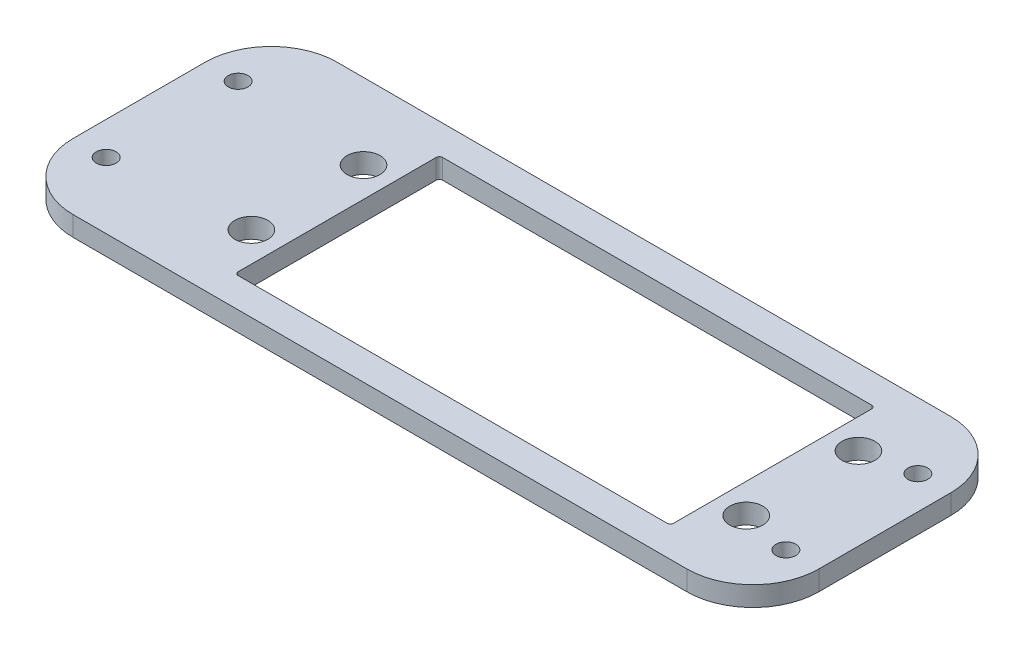
ISO-10303-21;
HEADER;
FILE_DESCRIPTION(('STEP AP214'),'2;1');
FILE_NAME('part.step','',(''),(''),'','','');
FILE_SCHEMA(('AUTOMOTIVE_DESIGN { 1 0 10303 214 1 1 1 1 }'));
ENDSEC;
DATA;
#1=APPLICATION_CONTEXT('core data for automotive mechanical design processes');
#2=APPLICATION_PROTOCOL_DEFINITION('international standard','automotive_design',2000,#1);
#3=PRODUCT_CONTEXT('',#1,'mechanical');
#4=PRODUCT('Part','Part','',(#3));
#5=PRODUCT_RELATED_PRODUCT_CATEGORY('part','',(#4));
#6=PRODUCT_DEFINITION_FORMATION('','',#4);
#7=PRODUCT_DEFINITION_CONTEXT('part definition',#1,'design');
#8=PRODUCT_DEFINITION('design','',#6,#7);
#9=PRODUCT_DEFINITION_SHAPE('','',#8);
#10=(LENGTH_UNIT() NAMED_UNIT(*) SI_UNIT(.MILLI.,.METRE.));
#11=(NAMED_UNIT(*) PLANE_ANGLE_UNIT() SI_UNIT($,.RADIAN.));
#12=(NAMED_UNIT(*) SI_UNIT($,.STERADIAN.) SOLID_ANGLE_UNIT());
#13=UNCERTAINTY_MEASURE_WITH_UNIT(LENGTH_MEASURE(1.E-05),#10,'distance_accuracy_value','');
#14=(GEOMETRIC_REPRESENTATION_CONTEXT(3) GLOBAL_UNCERTAINTY_ASSIGNED_CONTEXT((#13)) GLOBAL_UNIT_ASSIGNED_CONTEXT((#10,
#11,#12)) REPRESENTATION_CONTEXT('',''));
#15=CARTESIAN_POINT('',(0.,0.,0.));
#16=DIRECTION('',(0.,0.,1.));
#17=DIRECTION('',(1.,0.,0.));
#18=AXIS2_PLACEMENT_3D('',#15,#16,#17);
#19=CARTESIAN_POINT('',(33.,3.,0.));
#20=DIRECTION('',(-1.,0.,0.));
#21=DIRECTION('',(0.,0.,1.));
#22=AXIS2_PLACEMENT_3D('',#19,#20,#21);
#23=PLANE('',#22);
#24=DIRECTION('',(0.,0.,-1.));
#25=VECTOR('',#24,1.);
#26=CARTESIAN_POINT('',(33.,0.,0.));
#27=LINE('',#26,#25);
#28=CARTESIAN_POINT('',(33.,0.,15.));
#29=VERTEX_POINT('',#28);
#30=CARTESIAN_POINT('',(33.,0.,-15.));
#31=VERTEX_POINT('',#30);
#32=EDGE_CURVE('E183',#29,#31,#27,.T.);
#33=ORIENTED_EDGE('',*,*,#32,.F.);
#34=DIRECTION('',(0.,-1.,0.));
#35=VECTOR('',#34,1.);
#36=CARTESIAN_POINT('',(33.,3.,15.));
#37=LINE('',#36,#35);
#38=CARTESIAN_POINT('',(33.,3.,15.));
#39=VERTEX_POINT('',#38);
#40=EDGE_CURVE('E204',#29,#39,#37,.F.);
#41=ORIENTED_EDGE('',*,*,#40,.T.);
#42=DIRECTION('',(0.,0.,-1.));
#43=VECTOR('',#42,1.);
#44=CARTESIAN_POINT('',(33.,3.,0.));
#45=LINE('',#44,#43);
#46=CARTESIAN_POINT('',(33.,3.,-15.));
#47=VERTEX_POINT('',#46);
#48=EDGE_CURVE('E360',#39,#47,#45,.T.);
#49=ORIENTED_EDGE('',*,*,#48,.T.);
#50=DIRECTION('',(0.,-1.,0.));
#51=VECTOR('',#50,1.);
#52=CARTESIAN_POINT('',(33.,3.,-15.));
#53=LINE('',#52,#51);
#54=EDGE_CURVE('E192',#47,#31,#53,.T.);
#55=ORIENTED_EDGE('',*,*,#54,.T.);
#56=EDGE_LOOP('',(#33,#41,#49,#55));
#57=FACE_BOUND('',#56,.T.);
#58=ADVANCED_FACE('F45',(#57),#23,.T.);
#59=CARTESIAN_POINT('',(0.,3.,15.5));
#60=DIRECTION('',(0.,0.,-1.));
#61=DIRECTION('',(-1.,0.,0.));
#62=AXIS2_PLACEMENT_3D('',#59,#60,#61);
#63=PLANE('',#62);
#64=DIRECTION('',(1.,0.,0.));
#65=VECTOR('',#64,1.);
#66=CARTESIAN_POINT('',(0.,3.,15.5));
#67=LINE('',#66,#65);
#68=CARTESIAN_POINT('',(-32.5,3.,15.5));
#69=VERTEX_POINT('',#68);
#70=CARTESIAN_POINT('',(32.5,3.,15.5));
#71=VERTEX_POINT('',#70);
#72=EDGE_CURVE('E364',#69,#71,#67,.T.);
#73=ORIENTED_EDGE('',*,*,#72,.T.);
#74=DIRECTION('',(0.,-1.,0.));
#75=VECTOR('',#74,1.);
#76=CARTESIAN_POINT('',(32.5,0.,15.5));
#77=LINE('',#76,#75);
#78=CARTESIAN_POINT('',(32.5,0.,15.5));
#79=VERTEX_POINT('',#78);
#80=EDGE_CURVE('E181',#71,#79,#77,.T.);
#81=ORIENTED_EDGE('',*,*,#80,.T.);
#82=DIRECTION('',(1.,0.,0.));
#83=VECTOR('',#82,1.);
#84=CARTESIAN_POINT('',(0.,0.,15.5));
#85=LINE('',#84,#83);
#86=CARTESIAN_POINT('',(-32.5,0.,15.5));
#87=VERTEX_POINT('',#86);
#88=EDGE_CURVE('E163',#87,#79,#85,.T.);
#89=ORIENTED_EDGE('',*,*,#88,.F.);
#90=DIRECTION('',(0.,-1.,0.));
#91=VECTOR('',#90,1.);
#92=CARTESIAN_POINT('',(-32.5,3.,15.5));
#93=LINE('',#92,#91);
#94=EDGE_CURVE('E178',#87,#69,#93,.F.);
#95=ORIENTED_EDGE('',*,*,#94,.T.);
#96=EDGE_LOOP('',(#73,#81,#89,#95));
#97=FACE_BOUND('',#96,.T.);
#98=ADVANCED_FACE('F177',(#97),#63,.T.);
#99=CARTESIAN_POINT('',(-33.,3.,0.));
#100=DIRECTION('',(-1.,0.,0.));
#101=DIRECTION('',(0.,0.,1.));
#102=AXIS2_PLACEMENT_3D('',#99,#100,#101);
#103=PLANE('',#102);
#104=DIRECTION('',(0.,0.,-1.));
#105=VECTOR('',#104,1.);
#106=CARTESIAN_POINT('',(-33.,3.,0.));
#107=LINE('',#106,#105);
#108=CARTESIAN_POINT('',(-33.,3.,15.));
#109=VERTEX_POINT('',#108);
#110=CARTESIAN_POINT('',(-33.,3.,-15.));
#111=VERTEX_POINT('',#110);
#112=EDGE_CURVE('E367',#109,#111,#107,.T.);
#113=ORIENTED_EDGE('',*,*,#112,.F.);
#114=DIRECTION('',(0.,-1.,0.));
#115=VECTOR('',#114,1.);
#116=CARTESIAN_POINT('',(-33.,3.,15.));
#117=LINE('',#116,#115);
#118=CARTESIAN_POINT('',(-33.,0.,15.));
#119=VERTEX_POINT('',#118);
#120=EDGE_CURVE('E210',#109,#119,#117,.T.);
#121=ORIENTED_EDGE('',*,*,#120,.T.);
#122=DIRECTION('',(0.,0.,-1.));
#123=VECTOR('',#122,1.);
#124=CARTESIAN_POINT('',(-33.,0.,0.));
#125=LINE('',#124,#123);
#126=CARTESIAN_POINT('',(-33.,0.,-15.));
#127=VERTEX_POINT('',#126);
#128=EDGE_CURVE('E165',#119,#127,#125,.T.);
#129=ORIENTED_EDGE('',*,*,#128,.T.);
#130=DIRECTION('',(0.,-1.,0.));
#131=VECTOR('',#130,1.);
#132=CARTESIAN_POINT('',(-33.,3.,-15.));
#133=LINE('',#132,#131);
#134=EDGE_CURVE('E207',#127,#111,#133,.F.);
#135=ORIENTED_EDGE('',*,*,#134,.T.);
#136=EDGE_LOOP('',(#113,#121,#129,#135));
#137=FACE_BOUND('',#136,.T.);
#138=ADVANCED_FACE('F435',(#137),#103,.F.);
#139=CARTESIAN_POINT('',(0.,3.,20.));
#140=DIRECTION('',(0.,0.,-1.));
#141=DIRECTION('',(-1.,0.,0.));
#142=AXIS2_PLACEMENT_3D('',#139,#140,#141);
#143=PLANE('',#142);
#144=DIRECTION('',(1.,0.,0.));
#145=VECTOR('',#144,1.);
#146=CARTESIAN_POINT('',(0.,0.,20.));
#147=LINE('',#146,#145);
#148=CARTESIAN_POINT('',(-53.,0.,20.));
#149=VERTEX_POINT('',#148);
#150=CARTESIAN_POINT('',(40.,0.,20.));
#151=VERTEX_POINT('',#150);
#152=EDGE_CURVE('E402',#149,#151,#147,.T.);
#153=ORIENTED_EDGE('',*,*,#152,.T.);
#154=DIRECTION('',(0.,-1.,0.));
#155=VECTOR('',#154,1.);
#156=CARTESIAN_POINT('',(40.,3.,20.));
#157=LINE('',#156,#155);
#158=CARTESIAN_POINT('',(40.,3.,20.));
#159=VERTEX_POINT('',#158);
#160=EDGE_CURVE('E280',#151,#159,#157,.F.);
#161=ORIENTED_EDGE('',*,*,#160,.T.);
#162=DIRECTION('',(1.,0.,0.));
#163=VECTOR('',#162,1.);
#164=CARTESIAN_POINT('',(0.,3.,20.));
#165=LINE('',#164,#163);
#166=CARTESIAN_POINT('',(-53.,3.,20.));
#167=VERTEX_POINT('',#166);
#168=EDGE_CURVE('E344',#167,#159,#165,.T.);
#169=ORIENTED_EDGE('',*,*,#168,.F.);
#170=DIRECTION('',(0.,-1.,0.));
#171=VECTOR('',#170,1.);
#172=CARTESIAN_POINT('',(-53.,3.,20.));
#173=LINE('',#172,#171);
#174=EDGE_CURVE('E276',#167,#149,#173,.T.);
#175=ORIENTED_EDGE('',*,*,#174,.T.);
#176=EDGE_LOOP('',(#153,#161,#169,#175));
#177=FACE_BOUND('',#176,.T.);
#178=ADVANCED_FACE('F449',(#177),#143,.F.);
#179=CARTESIAN_POINT('',(50.,3.,0.));
#180=DIRECTION('',(-1.,0.,0.));
#181=DIRECTION('',(0.,0.,1.));
#182=AXIS2_PLACEMENT_3D('',#179,#180,#181);
#183=PLANE('',#182);
#184=DIRECTION('',(0.,0.,-1.));
#185=VECTOR('',#184,1.);
#186=CARTESIAN_POINT('',(50.,0.,0.));
#187=LINE('',#186,#185);
#188=CARTESIAN_POINT('',(50.,0.,10.));
#189=VERTEX_POINT('',#188);
#190=CARTESIAN_POINT('',(50.,0.,-10.));
#191=VERTEX_POINT('',#190);
#192=EDGE_CURVE('E301',#189,#191,#187,.T.);
#193=ORIENTED_EDGE('',*,*,#192,.T.);
#194=DIRECTION('',(0.,-1.,0.));
#195=VECTOR('',#194,1.);
#196=CARTESIAN_POINT('',(50.,3.,-10.));
#197=LINE('',#196,#195);
#198=CARTESIAN_POINT('',(50.,3.,-10.));
#199=VERTEX_POINT('',#198);
#200=EDGE_CURVE('E262',#191,#199,#197,.F.);
#201=ORIENTED_EDGE('',*,*,#200,.T.);
#202=DIRECTION('',(0.,0.,-1.));
#203=VECTOR('',#202,1.);
#204=CARTESIAN_POINT('',(50.,3.,0.));
#205=LINE('',#204,#203);
#206=CARTESIAN_POINT('',(50.,3.,10.));
#207=VERTEX_POINT('',#206);
#208=EDGE_CURVE('E350',#207,#199,#205,.T.);
#209=ORIENTED_EDGE('',*,*,#208,.F.);
#210=DIRECTION('',(0.,-1.,0.));
#211=VECTOR('',#210,1.);
#212=CARTESIAN_POINT('',(50.,3.,10.));
#213=LINE('',#212,#211);
#214=EDGE_CURVE('E258',#207,#189,#213,.T.);
#215=ORIENTED_EDGE('',*,*,#214,.T.);
#216=EDGE_LOOP('',(#193,#201,#209,#215));
#217=FACE_BOUND('',#216,.T.);
#218=ADVANCED_FACE('F410',(#217),#183,.F.);
#219=CARTESIAN_POINT('',(0.,3.,-20.));
#220=DIRECTION('',(0.,0.,-1.));
#221=DIRECTION('',(-1.,0.,0.));
#222=AXIS2_PLACEMENT_3D('',#219,#220,#221);
#223=PLANE('',#222);
#224=DIRECTION('',(1.,0.,0.));
#225=VECTOR('',#224,1.);
#226=CARTESIAN_POINT('',(0.,3.,-20.));
#227=LINE('',#226,#225);
#228=CARTESIAN_POINT('',(-53.,3.,-20.));
#229=VERTEX_POINT('',#228);
#230=CARTESIAN_POINT('',(40.,3.,-20.));
#231=VERTEX_POINT('',#230);
#232=EDGE_CURVE('E354',#229,#231,#227,.T.);
#233=ORIENTED_EDGE('',*,*,#232,.T.);
#234=DIRECTION('',(0.,-1.,0.));
#235=VECTOR('',#234,1.);
#236=CARTESIAN_POINT('',(40.,0.,-20.));
#237=LINE('',#236,#235);
#238=CARTESIAN_POINT('',(40.,0.,-20.));
#239=VERTEX_POINT('',#238);
#240=EDGE_CURVE('E242',#231,#239,#237,.T.);
#241=ORIENTED_EDGE('',*,*,#240,.T.);
#242=DIRECTION('',(1.,0.,0.));
#243=VECTOR('',#242,1.);
#244=CARTESIAN_POINT('',(0.,0.,-20.));
#245=LINE('',#244,#243);
#246=CARTESIAN_POINT('',(-53.,0.,-20.));
#247=VERTEX_POINT('',#246);
#248=EDGE_CURVE('E295',#247,#239,#245,.T.);
#249=ORIENTED_EDGE('',*,*,#248,.F.);
#250=DIRECTION('',(0.,-1.,0.));
#251=VECTOR('',#250,1.);
#252=CARTESIAN_POINT('',(-53.,3.,-20.));
#253=LINE('',#252,#251);
#254=EDGE_CURVE('E239',#247,#229,#253,.F.);
#255=ORIENTED_EDGE('',*,*,#254,.T.);
#256=EDGE_LOOP('',(#233,#241,#249,#255));
#257=FACE_BOUND('',#256,.T.);
#258=ADVANCED_FACE('F420',(#257),#223,.T.);
#259=CARTESIAN_POINT('',(-58.,3.,-10.));
#260=DIRECTION('',(0.,-1.,0.));
#261=DIRECTION('',(0.,0.,-1.));
#262=AXIS2_PLACEMENT_3D('',#259,#260,#261);
#263=CYLINDRICAL_SURFACE('',#262,1.5);
#264=CARTESIAN_POINT('',(-58.,3.,-10.));
#265=DIRECTION('',(0.,1.,0.));
#266=DIRECTION('',(0.,0.,1.));
#267=AXIS2_PLACEMENT_3D('',#264,#265,#266);
#268=CIRCLE('',#267,1.5);
#269=CARTESIAN_POINT('',(-58.,3.,-8.49999999999999));
#270=VERTEX_POINT('',#269);
#271=EDGE_CURVE('E195',#270,#270,#268,.T.);
#272=ORIENTED_EDGE('',*,*,#271,.T.);
#273=EDGE_LOOP('',(#272));
#274=FACE_BOUND('',#273,.T.);
#275=CARTESIAN_POINT('',(-58.,0.,-10.));
#276=DIRECTION('',(0.,1.,0.));
#277=DIRECTION('',(0.,0.,1.));
#278=AXIS2_PLACEMENT_3D('',#275,#276,#277);
#279=CIRCLE('',#278,1.5);
#280=CARTESIAN_POINT('',(-58.,0.,-8.49999999999999));
#281=VERTEX_POINT('',#280);
#282=EDGE_CURVE('E326',#281,#281,#279,.T.);
#283=ORIENTED_EDGE('',*,*,#282,.F.);
#284=EDGE_LOOP('',(#283));
#285=FACE_BOUND('',#284,.T.);
#286=ADVANCED_FACE('F446',(#274,#285),#263,.F.);
#287=CARTESIAN_POINT('',(45.,3.,10.));
#288=DIRECTION('',(0.,-1.,0.));
#289=DIRECTION('',(0.,0.,-1.));
#290=AXIS2_PLACEMENT_3D('',#287,#288,#289);
#291=CYLINDRICAL_SURFACE('',#290,1.5);
#292=CARTESIAN_POINT('',(45.,3.,10.));
#293=DIRECTION('',(0.,1.,0.));
#294=DIRECTION('',(0.,0.,1.));
#295=AXIS2_PLACEMENT_3D('',#292,#293,#294);
#296=CIRCLE('',#295,1.5);
#297=CARTESIAN_POINT('',(45.,3.,11.5));
#298=VERTEX_POINT('',#297);
#299=EDGE_CURVE('E387',#298,#298,#296,.F.);
#300=ORIENTED_EDGE('',*,*,#299,.F.);
#301=EDGE_LOOP('',(#300));
#302=FACE_BOUND('',#301,.T.);
#303=CARTESIAN_POINT('',(45.,0.,10.));
#304=DIRECTION('',(0.,1.,0.));
#305=DIRECTION('',(0.,0.,1.));
#306=AXIS2_PLACEMENT_3D('',#303,#304,#305);
#307=CIRCLE('',#306,1.5);
#308=CARTESIAN_POINT('',(45.,0.,11.5));
#309=VERTEX_POINT('',#308);
#310=EDGE_CURVE('E323',#309,#309,#307,.F.);
#311=ORIENTED_EDGE('',*,*,#310,.T.);
#312=EDGE_LOOP('',(#311));
#313=FACE_BOUND('',#312,.T.);
#314=ADVANCED_FACE('F616',(#302,#313),#291,.F.);
#315=CARTESIAN_POINT('',(45.,3.,-10.));
#316=DIRECTION('',(0.,-1.,0.));
#317=DIRECTION('',(0.,0.,-1.));
#318=AXIS2_PLACEMENT_3D('',#315,#316,#317);
#319=CYLINDRICAL_SURFACE('',#318,1.5);
#320=CARTESIAN_POINT('',(45.,3.,-10.));
#321=DIRECTION('',(0.,1.,0.));
#322=DIRECTION('',(0.,0.,1.));
#323=AXIS2_PLACEMENT_3D('',#320,#321,#322);
#324=CIRCLE('',#323,1.5);
#325=CARTESIAN_POINT('',(45.,3.,-8.49999999999999));
#326=VERTEX_POINT('',#325);
#327=EDGE_CURVE('E383',#326,#326,#324,.T.);
#328=ORIENTED_EDGE('',*,*,#327,.T.);
#329=EDGE_LOOP('',(#328));
#330=FACE_BOUND('',#329,.T.);
#331=CARTESIAN_POINT('',(45.,0.,-10.));
#332=DIRECTION('',(0.,1.,0.));
#333=DIRECTION('',(0.,0.,1.));
#334=AXIS2_PLACEMENT_3D('',#331,#332,#333);
#335=CIRCLE('',#334,1.5);
#336=CARTESIAN_POINT('',(45.,0.,-8.49999999999999));
#337=VERTEX_POINT('',#336);
#338=EDGE_CURVE('E319',#337,#337,#335,.T.);
#339=ORIENTED_EDGE('',*,*,#338,.F.);
#340=EDGE_LOOP('',(#339));
#341=FACE_BOUND('',#340,.T.);
#342=ADVANCED_FACE('F606',(#330,#341),#319,.F.);
#343=CARTESIAN_POINT('',(37.5,3.,8.49999999999999));
#344=DIRECTION('',(0.,-1.,0.));
#345=DIRECTION('',(0.,0.,-1.));
#346=AXIS2_PLACEMENT_3D('',#343,#344,#345);
#347=CYLINDRICAL_SURFACE('',#346,2.5);
#348=CARTESIAN_POINT('',(37.5,3.,8.49999999999999));
#349=DIRECTION('',(0.,1.,0.));
#350=DIRECTION('',(0.,0.,1.));
#351=AXIS2_PLACEMENT_3D('',#348,#349,#350);
#352=CIRCLE('',#351,2.5);
#353=CARTESIAN_POINT('',(37.5,3.,11.));
#354=VERTEX_POINT('',#353);
#355=EDGE_CURVE('E379',#354,#354,#352,.F.);
#356=ORIENTED_EDGE('',*,*,#355,.F.);
#357=EDGE_LOOP('',(#356));
#358=FACE_BOUND('',#357,.T.);
#359=CARTESIAN_POINT('',(37.5,0.,8.49999999999999));
#360=DIRECTION('',(0.,1.,0.));
#361=DIRECTION('',(0.,0.,1.));
#362=AXIS2_PLACEMENT_3D('',#359,#360,#361);
#363=CIRCLE('',#362,2.5);
#364=CARTESIAN_POINT('',(37.5,0.,11.));
#365=VERTEX_POINT('',#364);
#366=EDGE_CURVE('E315',#365,#365,#363,.F.);
#367=ORIENTED_EDGE('',*,*,#366,.T.);
#368=EDGE_LOOP('',(#367));
#369=FACE_BOUND('',#368,.T.);
#370=ADVANCED_FACE('F596',(#358,#369),#347,.F.);
#371=CARTESIAN_POINT('',(37.5,3.,-8.50000000000001));
#372=DIRECTION('',(0.,-1.,0.));
#373=DIRECTION('',(0.,0.,-1.));
#374=AXIS2_PLACEMENT_3D('',#371,#372,#373);
#375=CYLINDRICAL_SURFACE('',#374,2.5);
#376=CARTESIAN_POINT('',(37.5,3.,-8.50000000000001));
#377=DIRECTION('',(0.,1.,0.));
#378=DIRECTION('',(0.,0.,1.));
#379=AXIS2_PLACEMENT_3D('',#376,#377,#378);
#380=CIRCLE('',#379,2.5);
#381=CARTESIAN_POINT('',(37.5,3.,-6.00000000000001));
#382=VERTEX_POINT('',#381);
#383=EDGE_CURVE('E375',#382,#382,#380,.T.);
#384=ORIENTED_EDGE('',*,*,#383,.T.);
#385=EDGE_LOOP('',(#384));
#386=FACE_BOUND('',#385,.T.);
#387=CARTESIAN_POINT('',(37.5,0.,-8.50000000000001));
#388=DIRECTION('',(0.,1.,0.));
#389=DIRECTION('',(0.,0.,1.));
#390=AXIS2_PLACEMENT_3D('',#387,#388,#389);
#391=CIRCLE('',#390,2.5);
#392=CARTESIAN_POINT('',(37.5,0.,-6.00000000000001));
#393=VERTEX_POINT('',#392);
#394=EDGE_CURVE('E311',#393,#393,#391,.T.);
#395=ORIENTED_EDGE('',*,*,#394,.F.);
#396=EDGE_LOOP('',(#395));
#397=FACE_BOUND('',#396,.T.);
#398=ADVANCED_FACE('F586',(#386,#397),#375,.F.);
#399=CARTESIAN_POINT('',(0.,3.,-15.5));
#400=DIRECTION('',(0.,0.,-1.));
#401=DIRECTION('',(-1.,0.,0.));
#402=AXIS2_PLACEMENT_3D('',#399,#400,#401);
#403=PLANE('',#402);
#404=DIRECTION('',(1.,0.,0.));
#405=VECTOR('',#404,1.);
#406=CARTESIAN_POINT('',(0.,0.,-15.5));
#407=LINE('',#406,#405);
#408=CARTESIAN_POINT('',(-32.5,0.,-15.5));
#409=VERTEX_POINT('',#408);
#410=CARTESIAN_POINT('',(32.5,0.,-15.5));
#411=VERTEX_POINT('',#410);
#412=EDGE_CURVE('E307',#409,#411,#407,.T.);
#413=ORIENTED_EDGE('',*,*,#412,.T.);
#414=DIRECTION('',(0.,-1.,0.));
#415=VECTOR('',#414,1.);
#416=CARTESIAN_POINT('',(32.5,3.,-15.5));
#417=LINE('',#416,#415);
#418=CARTESIAN_POINT('',(32.5,3.,-15.5));
#419=VERTEX_POINT('',#418);
#420=EDGE_CURVE('E217',#411,#419,#417,.F.);
#421=ORIENTED_EDGE('',*,*,#420,.T.);
#422=DIRECTION('',(1.,0.,0.));
#423=VECTOR('',#422,1.);
#424=CARTESIAN_POINT('',(0.,3.,-15.5));
#425=LINE('',#424,#423);
#426=CARTESIAN_POINT('',(-32.5,3.,-15.5));
#427=VERTEX_POINT('',#426);
#428=EDGE_CURVE('E371',#427,#419,#425,.T.);
#429=ORIENTED_EDGE('',*,*,#428,.F.);
#430=DIRECTION('',(0.,-1.,0.));
#431=VECTOR('',#430,1.);
#432=CARTESIAN_POINT('',(-32.5,0.,-15.5));
#433=LINE('',#432,#431);
#434=EDGE_CURVE('E213',#427,#409,#433,.T.);
#435=ORIENTED_EDGE('',*,*,#434,.T.);
#436=EDGE_LOOP('',(#413,#421,#429,#435));
#437=FACE_BOUND('',#436,.T.);
#438=ADVANCED_FACE('F443',(#437),#403,.F.);
#439=CARTESIAN_POINT('',(-63.,3.,0.));
#440=DIRECTION('',(1.,0.,0.));
#441=DIRECTION('',(0.,0.,-1.));
#442=AXIS2_PLACEMENT_3D('',#439,#440,#441);
#443=PLANE('',#442);
#444=DIRECTION('',(0.,0.,1.));
#445=VECTOR('',#444,1.);
#446=CARTESIAN_POINT('',(-63.,0.,0.));
#447=LINE('',#446,#445);
#448=CARTESIAN_POINT('',(-63.,0.,-10.));
#449=VERTEX_POINT('',#448);
#450=CARTESIAN_POINT('',(-63.,0.,10.));
#451=VERTEX_POINT('',#450);
#452=EDGE_CURVE('E287',#449,#451,#447,.T.);
#453=ORIENTED_EDGE('',*,*,#452,.T.);
#454=DIRECTION('',(0.,-1.,0.));
#455=VECTOR('',#454,1.);
#456=CARTESIAN_POINT('',(-63.,3.,10.));
#457=LINE('',#456,#455);
#458=CARTESIAN_POINT('',(-63.,3.,10.));
#459=VERTEX_POINT('',#458);
#460=EDGE_CURVE('E11',#451,#459,#457,.F.);
#461=ORIENTED_EDGE('',*,*,#460,.T.);
#462=DIRECTION('',(0.,0.,1.));
#463=VECTOR('',#462,1.);
#464=CARTESIAN_POINT('',(-63.,3.,0.));
#465=LINE('',#464,#463);
#466=CARTESIAN_POINT('',(-63.,3.,-10.));
#467=VERTEX_POINT('',#466);
#468=EDGE_CURVE('E288',#467,#459,#465,.T.);
#469=ORIENTED_EDGE('',*,*,#468,.F.);
#470=DIRECTION('',(0.,-1.,0.));
#471=VECTOR('',#470,1.);
#472=CARTESIAN_POINT('',(-63.,0.,-10.));
#473=LINE('',#472,#471);
#474=EDGE_CURVE('E54',#467,#449,#473,.T.);
#475=ORIENTED_EDGE('',*,*,#474,.T.);
#476=EDGE_LOOP('',(#453,#461,#469,#475));
#477=FACE_BOUND('',#476,.T.);
#478=ADVANCED_FACE('F286',(#477),#443,.F.);
#479=CARTESIAN_POINT('',(-37.5,3.,8.49999999999999));
#480=DIRECTION('',(0.,-1.,0.));
#481=DIRECTION('',(0.,0.,-1.));
#482=AXIS2_PLACEMENT_3D('',#479,#480,#481);
#483=CYLINDRICAL_SURFACE('',#482,2.5);
#484=CARTESIAN_POINT('',(-37.5,3.,8.49999999999999));
#485=DIRECTION('',(0.,1.,0.));
#486=DIRECTION('',(0.,0.,1.));
#487=AXIS2_PLACEMENT_3D('',#484,#485,#486);
#488=CIRCLE('',#487,2.5);
#489=CARTESIAN_POINT('',(-37.5,3.,11.));
#490=VERTEX_POINT('',#489);
#491=EDGE_CURVE('E338',#490,#490,#488,.T.);
#492=ORIENTED_EDGE('',*,*,#491,.T.);
#493=EDGE_LOOP('',(#492));
#494=FACE_BOUND('',#493,.T.);
#495=CARTESIAN_POINT('',(-37.5,0.,8.49999999999999));
#496=DIRECTION('',(0.,1.,0.));
#497=DIRECTION('',(0.,0.,1.));
#498=AXIS2_PLACEMENT_3D('',#495,#496,#497);
#499=CIRCLE('',#498,2.5);
#500=CARTESIAN_POINT('',(-37.5,0.,11.));
#501=VERTEX_POINT('',#500);
#502=EDGE_CURVE('E398',#501,#501,#499,.T.);
#503=ORIENTED_EDGE('',*,*,#502,.F.);
#504=EDGE_LOOP('',(#503));
#505=FACE_BOUND('',#504,.T.);
#506=ADVANCED_FACE('F442',(#494,#505),#483,.F.);
#507=CARTESIAN_POINT('',(-37.5,3.,-8.50000000000001));
#508=DIRECTION('',(0.,-1.,0.));
#509=DIRECTION('',(0.,0.,-1.));
#510=AXIS2_PLACEMENT_3D('',#507,#508,#509);
#511=CYLINDRICAL_SURFACE('',#510,2.5);
#512=CARTESIAN_POINT('',(-37.5,3.,-8.50000000000001));
#513=DIRECTION('',(0.,1.,0.));
#514=DIRECTION('',(0.,0.,1.));
#515=AXIS2_PLACEMENT_3D('',#512,#513,#514);
#516=CIRCLE('',#515,2.5);
#517=CARTESIAN_POINT('',(-37.5,3.,-6.00000000000001));
#518=VERTEX_POINT('',#517);
#519=EDGE_CURVE('E333',#518,#518,#516,.F.);
#520=ORIENTED_EDGE('',*,*,#519,.F.);
#521=EDGE_LOOP('',(#520));
#522=FACE_BOUND('',#521,.T.);
#523=CARTESIAN_POINT('',(-37.5,0.,-8.50000000000001));
#524=DIRECTION('',(0.,1.,0.));
#525=DIRECTION('',(0.,0.,1.));
#526=AXIS2_PLACEMENT_3D('',#523,#524,#525);
#527=CIRCLE('',#526,2.5);
#528=CARTESIAN_POINT('',(-37.5,0.,-6.00000000000001));
#529=VERTEX_POINT('',#528);
#530=EDGE_CURVE('E394',#529,#529,#527,.F.);
#531=ORIENTED_EDGE('',*,*,#530,.T.);
#532=EDGE_LOOP('',(#531));
#533=FACE_BOUND('',#532,.T.);
#534=ADVANCED_FACE('F455',(#522,#533),#511,.F.);
#535=CARTESIAN_POINT('',(-58.,3.,10.));
#536=DIRECTION('',(0.,-1.,0.));
#537=DIRECTION('',(0.,0.,-1.));
#538=AXIS2_PLACEMENT_3D('',#535,#536,#537);
#539=CYLINDRICAL_SURFACE('',#538,1.5);
#540=CARTESIAN_POINT('',(-58.,3.,10.));
#541=DIRECTION('',(0.,1.,0.));
#542=DIRECTION('',(0.,0.,1.));
#543=AXIS2_PLACEMENT_3D('',#540,#541,#542);
#544=CIRCLE('',#543,1.5);
#545=CARTESIAN_POINT('',(-58.,3.,11.5));
#546=VERTEX_POINT('',#545);
#547=EDGE_CURVE('E188',#546,#546,#544,.F.);
#548=ORIENTED_EDGE('',*,*,#547,.F.);
#549=EDGE_LOOP('',(#548));
#550=FACE_BOUND('',#549,.T.);
#551=CARTESIAN_POINT('',(-58.,0.,10.));
#552=DIRECTION('',(0.,1.,0.));
#553=DIRECTION('',(0.,0.,1.));
#554=AXIS2_PLACEMENT_3D('',#551,#552,#553);
#555=CIRCLE('',#554,1.5);
#556=CARTESIAN_POINT('',(-58.,0.,11.5));
#557=VERTEX_POINT('',#556);
#558=EDGE_CURVE('E198',#557,#557,#555,.F.);
#559=ORIENTED_EDGE('',*,*,#558,.T.);
#560=EDGE_LOOP('',(#559));
#561=FACE_BOUND('',#560,.T.);
#562=ADVANCED_FACE('F459',(#550,#561),#539,.F.);
#563=CARTESIAN_POINT('',(0.,3.,0.));
#564=DIRECTION('',(0.,1.,0.));
#565=DIRECTION('',(0.,0.,1.));
#566=AXIS2_PLACEMENT_3D('',#563,#564,#565);
#567=PLANE('',#566);
#568=ORIENTED_EDGE('',*,*,#519,.T.);
#569=EDGE_LOOP('',(#568));
#570=FACE_BOUND('',#569,.T.);
#571=ORIENTED_EDGE('',*,*,#491,.F.);
#572=EDGE_LOOP('',(#571));
#573=FACE_BOUND('',#572,.T.);
#574=ORIENTED_EDGE('',*,*,#208,.T.);
#575=CARTESIAN_POINT('',(40.,3.,-10.));
#576=DIRECTION('',(0.,1.,0.));
#577=DIRECTION('',(0.,0.,1.));
#578=AXIS2_PLACEMENT_3D('',#575,#576,#577);
#579=CIRCLE('',#578,10.);
#580=EDGE_CURVE('E273',#199,#231,#579,.T.);
#581=ORIENTED_EDGE('',*,*,#580,.T.);
#582=ORIENTED_EDGE('',*,*,#232,.F.);
#583=CARTESIAN_POINT('',(-53.,3.,-10.));
#584=DIRECTION('',(0.,1.,0.));
#585=DIRECTION('',(0.,0.,1.));
#586=AXIS2_PLACEMENT_3D('',#583,#584,#585);
#587=CIRCLE('',#586,10.);
#588=EDGE_CURVE('E66',#229,#467,#587,.T.);
#589=ORIENTED_EDGE('',*,*,#588,.T.);
#590=ORIENTED_EDGE('',*,*,#468,.T.);
#591=CARTESIAN_POINT('',(-53.,3.,10.));
#592=DIRECTION('',(0.,1.,0.));
#593=DIRECTION('',(0.,0.,1.));
#594=AXIS2_PLACEMENT_3D('',#591,#592,#593);
#595=CIRCLE('',#594,10.);
#596=EDGE_CURVE('E267',#459,#167,#595,.T.);
#597=ORIENTED_EDGE('',*,*,#596,.T.);
#598=ORIENTED_EDGE('',*,*,#168,.T.);
#599=CARTESIAN_POINT('',(40.,3.,10.));
#600=DIRECTION('',(0.,1.,0.));
#601=DIRECTION('',(0.,0.,1.));
#602=AXIS2_PLACEMENT_3D('',#599,#600,#601);
#603=CIRCLE('',#602,10.);
#604=EDGE_CURVE('E270',#159,#207,#603,.T.);
#605=ORIENTED_EDGE('',*,*,#604,.T.);
#606=EDGE_LOOP('',(#574,#581,#582,#589,#590,#597,#598,#605));
#607=FACE_BOUND('',#606,.T.);
#608=ORIENTED_EDGE('',*,*,#48,.F.);
#609=CARTESIAN_POINT('',(32.5,3.,15.));
#610=DIRECTION('',(0.,1.,0.));
#611=DIRECTION('',(0.,0.,1.));
#612=AXIS2_PLACEMENT_3D('',#609,#610,#611);
#613=CIRCLE('',#612,0.5);
#614=EDGE_CURVE('E172',#39,#71,#613,.F.);
#615=ORIENTED_EDGE('',*,*,#614,.T.);
#616=ORIENTED_EDGE('',*,*,#72,.F.);
#617=CARTESIAN_POINT('',(-32.5,3.,15.));
#618=DIRECTION('',(0.,1.,0.));
#619=DIRECTION('',(0.,0.,1.));
#620=AXIS2_PLACEMENT_3D('',#617,#618,#619);
#621=CIRCLE('',#620,0.5);
#622=EDGE_CURVE('E171',#69,#109,#621,.F.);
#623=ORIENTED_EDGE('',*,*,#622,.T.);
#624=ORIENTED_EDGE('',*,*,#112,.T.);
#625=CARTESIAN_POINT('',(-32.5,3.,-15.));
#626=DIRECTION('',(0.,1.,0.));
#627=DIRECTION('',(0.,0.,1.));
#628=AXIS2_PLACEMENT_3D('',#625,#626,#627);
#629=CIRCLE('',#628,0.5);
#630=EDGE_CURVE('E236',#111,#427,#629,.F.);
#631=ORIENTED_EDGE('',*,*,#630,.T.);
#632=ORIENTED_EDGE('',*,*,#428,.T.);
#633=CARTESIAN_POINT('',(32.5,3.,-15.));
#634=DIRECTION('',(0.,1.,0.));
#635=DIRECTION('',(0.,0.,1.));
#636=AXIS2_PLACEMENT_3D('',#633,#634,#635);
#637=CIRCLE('',#636,0.5);
#638=EDGE_CURVE('E230',#419,#47,#637,.F.);
#639=ORIENTED_EDGE('',*,*,#638,.T.);
#640=EDGE_LOOP('',(#608,#615,#616,#623,#624,#631,#632,#639));
#641=FACE_BOUND('',#640,.T.);
#642=ORIENTED_EDGE('',*,*,#383,.F.);
#643=EDGE_LOOP('',(#642));
#644=FACE_BOUND('',#643,.T.);
#645=ORIENTED_EDGE('',*,*,#355,.T.);
#646=EDGE_LOOP('',(#645));
#647=FACE_BOUND('',#646,.T.);
#648=ORIENTED_EDGE('',*,*,#327,.F.);
#649=EDGE_LOOP('',(#648));
#650=FACE_BOUND('',#649,.T.);
#651=ORIENTED_EDGE('',*,*,#299,.T.);
#652=EDGE_LOOP('',(#651));
#653=FACE_BOUND('',#652,.T.);
#654=ORIENTED_EDGE('',*,*,#271,.F.);
#655=EDGE_LOOP('',(#654));
#656=FACE_BOUND('',#655,.T.);
#657=ORIENTED_EDGE('',*,*,#547,.T.);
#658=EDGE_LOOP('',(#657));
#659=FACE_BOUND('',#658,.T.);
#660=ADVANCED_FACE('F417',(#570,#573,#607,#641,#644,#647,#650,#653,#656,#659),#567,.T.);
#661=CARTESIAN_POINT('',(0.,0.,0.));
#662=DIRECTION('',(0.,1.,0.));
#663=DIRECTION('',(0.,0.,1.));
#664=AXIS2_PLACEMENT_3D('',#661,#662,#663);
#665=PLANE('',#664);
#666=ORIENTED_EDGE('',*,*,#530,.F.);
#667=EDGE_LOOP('',(#666));
#668=FACE_BOUND('',#667,.T.);
#669=ORIENTED_EDGE('',*,*,#502,.T.);
#670=EDGE_LOOP('',(#669));
#671=FACE_BOUND('',#670,.T.);
#672=ORIENTED_EDGE('',*,*,#248,.T.);
#673=CARTESIAN_POINT('',(40.,0.,-10.));
#674=DIRECTION('',(0.,1.,0.));
#675=DIRECTION('',(0.,0.,1.));
#676=AXIS2_PLACEMENT_3D('',#673,#674,#675);
#677=CIRCLE('',#676,10.);
#678=EDGE_CURVE('E255',#239,#191,#677,.F.);
#679=ORIENTED_EDGE('',*,*,#678,.T.);
#680=ORIENTED_EDGE('',*,*,#192,.F.);
#681=CARTESIAN_POINT('',(40.,0.,10.));
#682=DIRECTION('',(0.,1.,0.));
#683=DIRECTION('',(0.,0.,1.));
#684=AXIS2_PLACEMENT_3D('',#681,#682,#683);
#685=CIRCLE('',#684,10.);
#686=EDGE_CURVE('E252',#189,#151,#685,.F.);
#687=ORIENTED_EDGE('',*,*,#686,.T.);
#688=ORIENTED_EDGE('',*,*,#152,.F.);
#689=CARTESIAN_POINT('',(-53.,0.,10.));
#690=DIRECTION('',(0.,1.,0.));
#691=DIRECTION('',(0.,0.,1.));
#692=AXIS2_PLACEMENT_3D('',#689,#690,#691);
#693=CIRCLE('',#692,10.);
#694=EDGE_CURVE('E249',#149,#451,#693,.F.);
#695=ORIENTED_EDGE('',*,*,#694,.T.);
#696=ORIENTED_EDGE('',*,*,#452,.F.);
#697=CARTESIAN_POINT('',(-53.,0.,-10.));
#698=DIRECTION('',(0.,1.,0.));
#699=DIRECTION('',(0.,0.,1.));
#700=AXIS2_PLACEMENT_3D('',#697,#698,#699);
#701=CIRCLE('',#700,10.);
#702=EDGE_CURVE('E246',#449,#247,#701,.F.);
#703=ORIENTED_EDGE('',*,*,#702,.T.);
#704=EDGE_LOOP('',(#672,#679,#680,#687,#688,#695,#696,#703));
#705=FACE_BOUND('',#704,.T.);
#706=ORIENTED_EDGE('',*,*,#88,.T.);
#707=CARTESIAN_POINT('',(32.5,0.,15.));
#708=DIRECTION('',(0.,1.,0.));
#709=DIRECTION('',(0.,0.,1.));
#710=AXIS2_PLACEMENT_3D('',#707,#708,#709);
#711=CIRCLE('',#710,0.5);
#712=EDGE_CURVE('E220',#79,#29,#711,.T.);
#713=ORIENTED_EDGE('',*,*,#712,.T.);
#714=ORIENTED_EDGE('',*,*,#32,.T.);
#715=CARTESIAN_POINT('',(32.5,0.,-15.));
#716=DIRECTION('',(0.,1.,0.));
#717=DIRECTION('',(0.,0.,1.));
#718=AXIS2_PLACEMENT_3D('',#715,#716,#717);
#719=CIRCLE('',#718,0.5);
#720=EDGE_CURVE('E227',#31,#411,#719,.T.);
#721=ORIENTED_EDGE('',*,*,#720,.T.);
#722=ORIENTED_EDGE('',*,*,#412,.F.);
#723=CARTESIAN_POINT('',(-32.5,0.,-15.));
#724=DIRECTION('',(0.,1.,0.));
#725=DIRECTION('',(0.,0.,1.));
#726=AXIS2_PLACEMENT_3D('',#723,#724,#725);
#727=CIRCLE('',#726,0.5);
#728=EDGE_CURVE('E233',#409,#127,#727,.T.);
#729=ORIENTED_EDGE('',*,*,#728,.T.);
#730=ORIENTED_EDGE('',*,*,#128,.F.);
#731=CARTESIAN_POINT('',(-32.5,0.,15.));
#732=DIRECTION('',(0.,1.,0.));
#733=DIRECTION('',(0.,0.,1.));
#734=AXIS2_PLACEMENT_3D('',#731,#732,#733);
#735=CIRCLE('',#734,0.5);
#736=EDGE_CURVE('E159',#119,#87,#735,.T.);
#737=ORIENTED_EDGE('',*,*,#736,.T.);
#738=EDGE_LOOP('',(#706,#713,#714,#721,#722,#729,#730,#737));
#739=FACE_BOUND('',#738,.T.);
#740=ORIENTED_EDGE('',*,*,#394,.T.);
#741=EDGE_LOOP('',(#740));
#742=FACE_BOUND('',#741,.T.);
#743=ORIENTED_EDGE('',*,*,#366,.F.);
#744=EDGE_LOOP('',(#743));
#745=FACE_BOUND('',#744,.T.);
#746=ORIENTED_EDGE('',*,*,#338,.T.);
#747=EDGE_LOOP('',(#746));
#748=FACE_BOUND('',#747,.T.);
#749=ORIENTED_EDGE('',*,*,#310,.F.);
#750=EDGE_LOOP('',(#749));
#751=FACE_BOUND('',#750,.T.);
#752=ORIENTED_EDGE('',*,*,#282,.T.);
#753=EDGE_LOOP('',(#752));
#754=FACE_BOUND('',#753,.T.);
#755=ORIENTED_EDGE('',*,*,#558,.F.);
#756=EDGE_LOOP('',(#755));
#757=FACE_BOUND('',#756,.T.);
#758=ADVANCED_FACE('F161',(#668,#671,#705,#739,#742,#745,#748,#751,#754,#757),#665,.F.);
#759=CARTESIAN_POINT('',(32.5,3.,15.));
#760=DIRECTION('',(0.,1.,0.));
#761=DIRECTION('',(0.,0.,1.));
#762=AXIS2_PLACEMENT_3D('',#759,#760,#761);
#763=CYLINDRICAL_SURFACE('',#762,0.5);
#764=ORIENTED_EDGE('',*,*,#614,.F.);
#765=ORIENTED_EDGE('',*,*,#40,.F.);
#766=ORIENTED_EDGE('',*,*,#712,.F.);
#767=ORIENTED_EDGE('',*,*,#80,.F.);
#768=EDGE_LOOP('',(#764,#765,#766,#767));
#769=FACE_BOUND('',#768,.T.);
#770=ADVANCED_FACE('F461',(#769),#763,.F.);
#771=CARTESIAN_POINT('',(-32.5,3.,15.));
#772=DIRECTION('',(0.,-1.,0.));
#773=DIRECTION('',(0.,0.,-1.));
#774=AXIS2_PLACEMENT_3D('',#771,#772,#773);
#775=CYLINDRICAL_SURFACE('',#774,0.5);
#776=ORIENTED_EDGE('',*,*,#622,.F.);
#777=ORIENTED_EDGE('',*,*,#94,.F.);
#778=ORIENTED_EDGE('',*,*,#736,.F.);
#779=ORIENTED_EDGE('',*,*,#120,.F.);
#780=EDGE_LOOP('',(#776,#777,#778,#779));
#781=FACE_BOUND('',#780,.T.);
#782=ADVANCED_FACE('F186',(#781),#775,.F.);
#783=CARTESIAN_POINT('',(32.5,3.,-15.));
#784=DIRECTION('',(0.,-1.,0.));
#785=DIRECTION('',(0.,0.,-1.));
#786=AXIS2_PLACEMENT_3D('',#783,#784,#785);
#787=CYLINDRICAL_SURFACE('',#786,0.5);
#788=ORIENTED_EDGE('',*,*,#638,.F.);
#789=ORIENTED_EDGE('',*,*,#420,.F.);
#790=ORIENTED_EDGE('',*,*,#720,.F.);
#791=ORIENTED_EDGE('',*,*,#54,.F.);
#792=EDGE_LOOP('',(#788,#789,#790,#791));
#793=FACE_BOUND('',#792,.T.);
#794=ADVANCED_FACE('F467',(#793),#787,.F.);
#795=CARTESIAN_POINT('',(-32.5,3.,-15.));
#796=DIRECTION('',(0.,1.,0.));
#797=DIRECTION('',(0.,0.,1.));
#798=AXIS2_PLACEMENT_3D('',#795,#796,#797);
#799=CYLINDRICAL_SURFACE('',#798,0.5);
#800=ORIENTED_EDGE('',*,*,#630,.F.);
#801=ORIENTED_EDGE('',*,*,#134,.F.);
#802=ORIENTED_EDGE('',*,*,#728,.F.);
#803=ORIENTED_EDGE('',*,*,#434,.F.);
#804=EDGE_LOOP('',(#800,#801,#802,#803));
#805=FACE_BOUND('',#804,.T.);
#806=ADVANCED_FACE('F470',(#805),#799,.F.);
#807=CARTESIAN_POINT('',(40.,3.,-10.));
#808=DIRECTION('',(0.,1.,0.));
#809=DIRECTION('',(0.,0.,1.));
#810=AXIS2_PLACEMENT_3D('',#807,#808,#809);
#811=CYLINDRICAL_SURFACE('',#810,10.);
#812=ORIENTED_EDGE('',*,*,#580,.F.);
#813=ORIENTED_EDGE('',*,*,#200,.F.);
#814=ORIENTED_EDGE('',*,*,#678,.F.);
#815=ORIENTED_EDGE('',*,*,#240,.F.);
#816=EDGE_LOOP('',(#812,#813,#814,#815));
#817=FACE_BOUND('',#816,.T.);
#818=ADVANCED_FACE('F415',(#817),#811,.T.);
#819=CARTESIAN_POINT('',(40.,3.,10.));
#820=DIRECTION('',(0.,-1.,0.));
#821=DIRECTION('',(0.,0.,-1.));
#822=AXIS2_PLACEMENT_3D('',#819,#820,#821);
#823=CYLINDRICAL_SURFACE('',#822,10.);
#824=ORIENTED_EDGE('',*,*,#604,.F.);
#825=ORIENTED_EDGE('',*,*,#160,.F.);
#826=ORIENTED_EDGE('',*,*,#686,.F.);
#827=ORIENTED_EDGE('',*,*,#214,.F.);
#828=EDGE_LOOP('',(#824,#825,#826,#827));
#829=FACE_BOUND('',#828,.T.);
#830=ADVANCED_FACE('F427',(#829),#823,.T.);
#831=CARTESIAN_POINT('',(-53.,3.,10.));
#832=DIRECTION('',(0.,-1.,0.));
#833=DIRECTION('',(0.,0.,-1.));
#834=AXIS2_PLACEMENT_3D('',#831,#832,#833);
#835=CYLINDRICAL_SURFACE('',#834,10.);
#836=ORIENTED_EDGE('',*,*,#596,.F.);
#837=ORIENTED_EDGE('',*,*,#460,.F.);
#838=ORIENTED_EDGE('',*,*,#694,.F.);
#839=ORIENTED_EDGE('',*,*,#174,.F.);
#840=EDGE_LOOP('',(#836,#837,#838,#839));
#841=FACE_BOUND('',#840,.T.);
#842=ADVANCED_FACE('F423',(#841),#835,.T.);
#843=CARTESIAN_POINT('',(-53.,3.,-10.));
#844=DIRECTION('',(0.,1.,0.));
#845=DIRECTION('',(0.,0.,1.));
#846=AXIS2_PLACEMENT_3D('',#843,#844,#845);
#847=CYLINDRICAL_SURFACE('',#846,10.);
#848=ORIENTED_EDGE('',*,*,#588,.F.);
#849=ORIENTED_EDGE('',*,*,#254,.F.);
#850=ORIENTED_EDGE('',*,*,#702,.F.);
#851=ORIENTED_EDGE('',*,*,#474,.F.);
#852=EDGE_LOOP('',(#848,#849,#850,#851));
#853=FACE_BOUND('',#852,.T.);
#854=ADVANCED_FACE('F47',(#853),#847,.T.);
#855=CLOSED_SHELL('',(#58,#98,#138,#178,#218,#258,#286,#314,#342,#370,#398,#438,#478,#506,#534,
#562,#660,#758,#770,#782,#794,#806,#818,#830,#842,#854));
#856=MANIFOLD_SOLID_BREP('B2',#855);
#857=ADVANCED_BREP_SHAPE_REPRESENTATION('',(#18,#856),#14);
#858=SHAPE_DEFINITION_REPRESENTATION(#9,#857);
ENDSEC;
END-ISO-10303-21;
